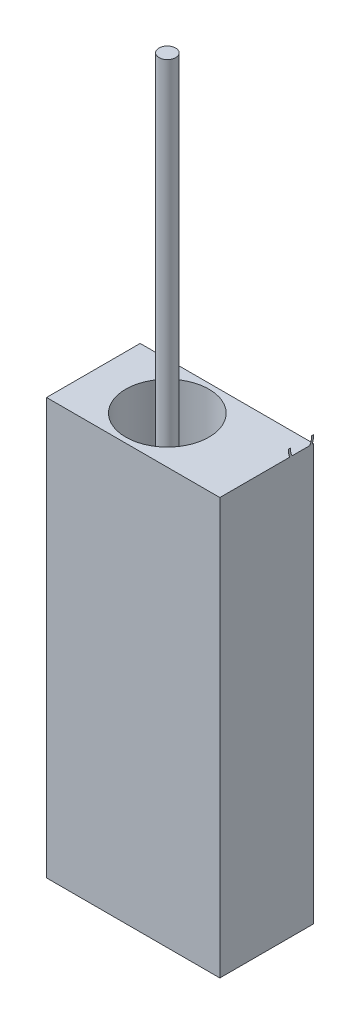
ISO-10303-21;
HEADER;
FILE_DESCRIPTION(('STEP AP214'),'2;1');
FILE_NAME('part.step','',(''),(''),'','','');
FILE_SCHEMA(('AUTOMOTIVE_DESIGN { 1 0 10303 214 1 1 1 1 }'));
ENDSEC;
DATA;
#1=APPLICATION_CONTEXT('core data for automotive mechanical design processes');
#2=APPLICATION_PROTOCOL_DEFINITION('international standard','automotive_design',2000,#1);
#3=PRODUCT_CONTEXT('',#1,'mechanical');
#4=PRODUCT('Part','Part','',(#3));
#5=PRODUCT_RELATED_PRODUCT_CATEGORY('part','',(#4));
#6=PRODUCT_DEFINITION_FORMATION('','',#4);
#7=PRODUCT_DEFINITION_CONTEXT('part definition',#1,'design');
#8=PRODUCT_DEFINITION('design','',#6,#7);
#9=PRODUCT_DEFINITION_SHAPE('','',#8);
#10=(LENGTH_UNIT() NAMED_UNIT(*) SI_UNIT(.MILLI.,.METRE.));
#11=(NAMED_UNIT(*) PLANE_ANGLE_UNIT() SI_UNIT($,.RADIAN.));
#12=(NAMED_UNIT(*) SI_UNIT($,.STERADIAN.) SOLID_ANGLE_UNIT());
#13=UNCERTAINTY_MEASURE_WITH_UNIT(LENGTH_MEASURE(1.E-05),#10,'distance_accuracy_value','');
#14=(GEOMETRIC_REPRESENTATION_CONTEXT(3) GLOBAL_UNCERTAINTY_ASSIGNED_CONTEXT((#13)) GLOBAL_UNIT_ASSIGNED_CONTEXT((#10,
#11,#12)) REPRESENTATION_CONTEXT('',''));
#15=CARTESIAN_POINT('',(0.,0.,0.));
#16=DIRECTION('',(0.,0.,1.));
#17=DIRECTION('',(1.,0.,0.));
#18=AXIS2_PLACEMENT_3D('',#15,#16,#17);
#19=CARTESIAN_POINT('',(-90.4994041492041,-2.69736399204684,56.4999999999975));
#20=DIRECTION('',(0.,1.,0.));
#21=DIRECTION('',(0.,0.,1.));
#22=AXIS2_PLACEMENT_3D('',#19,#20,#21);
#23=CYLINDRICAL_SURFACE('',#22,4.00000000000001);
#24=CARTESIAN_POINT('',(-90.4994041492041,-2.69736399204684,56.4999999999975));
#25=DIRECTION('',(0.,1.,0.));
#26=DIRECTION('',(0.,0.,1.));
#27=AXIS2_PLACEMENT_3D('',#24,#25,#26);
#28=CIRCLE('',#27,4.00000000000001);
#29=CARTESIAN_POINT('',(-90.4994041492041,-2.69736399204684,60.4999999999976));
#30=VERTEX_POINT('',#29);
#31=EDGE_CURVE('E11',#30,#30,#28,.T.);
#32=ORIENTED_EDGE('',*,*,#31,.T.);
#33=EDGE_LOOP('',(#32));
#34=FACE_BOUND('',#33,.T.);
#35=CARTESIAN_POINT('',(-90.4994041492041,297.302636007953,56.4999999999975));
#36=DIRECTION('',(0.,1.,0.));
#37=DIRECTION('',(0.,0.,1.));
#38=AXIS2_PLACEMENT_3D('',#35,#36,#37);
#39=CIRCLE('',#38,4.00000000000001);
#40=CARTESIAN_POINT('',(-90.4994041492041,297.302636007953,60.4999999999976));
#41=VERTEX_POINT('',#40);
#42=EDGE_CURVE('E44',#41,#41,#39,.T.);
#43=ORIENTED_EDGE('',*,*,#42,.F.);
#44=EDGE_LOOP('',(#43));
#45=FACE_BOUND('',#44,.T.);
#46=ADVANCED_FACE('F41',(#34,#45),#23,.T.);
#47=CARTESIAN_POINT('',(-90.4994041492041,-2.69736399204684,56.4999999999975));
#48=DIRECTION('',(0.,1.,0.));
#49=DIRECTION('',(0.,0.,1.));
#50=AXIS2_PLACEMENT_3D('',#47,#48,#49);
#51=PLANE('',#50);
#52=ORIENTED_EDGE('',*,*,#31,.F.);
#53=EDGE_LOOP('',(#52));
#54=FACE_BOUND('',#53,.T.);
#55=ADVANCED_FACE('F56',(#54),#51,.F.);
#56=CARTESIAN_POINT('',(-90.4994041492041,297.302636007953,56.4999999999975));
#57=DIRECTION('',(0.,1.,0.));
#58=DIRECTION('',(0.,0.,1.));
#59=AXIS2_PLACEMENT_3D('',#56,#57,#58);
#60=PLANE('',#59);
#61=ORIENTED_EDGE('',*,*,#42,.T.);
#62=EDGE_LOOP('',(#61));
#63=FACE_BOUND('',#62,.T.);
#64=ADVANCED_FACE('F53',(#63),#60,.T.);
#65=CLOSED_SHELL('',(#46,#55,#64));
#66=MANIFOLD_SOLID_BREP('B2',#65);
#67=CARTESIAN_POINT('',(-42.7700000000017,150.,39.9999999999982));
#68=DIRECTION('',(1.,0.,0.));
#69=DIRECTION('',(0.,0.,-1.));
#70=AXIS2_PLACEMENT_3D('',#67,#68,#69);
#71=CYLINDRICAL_SURFACE('',#70,5.);
#72=DIRECTION('',(1.,0.,0.));
#73=VECTOR('',#72,1.);
#74=CARTESIAN_POINT('',(-42.7700000000019,150.,44.9999999999982));
#75=LINE('',#74,#73);
#76=CARTESIAN_POINT('',(-42.7700000000019,150.,44.9999999999982));
#77=VERTEX_POINT('',#76);
#78=CARTESIAN_POINT('',(-42.7652962136165,150.,44.9999999999982));
#79=VERTEX_POINT('',#78);
#80=EDGE_CURVE('E265',#77,#79,#75,.T.);
#81=ORIENTED_EDGE('',*,*,#80,.T.);
#82=CARTESIAN_POINT('',(-42.7652962136165,150.,39.9999999999982));
#83=DIRECTION('',(-1.,0.,0.));
#84=DIRECTION('',(0.,0.,1.));
#85=AXIS2_PLACEMENT_3D('',#82,#83,#84);
#86=CIRCLE('',#85,5.);
#87=CARTESIAN_POINT('',(-42.7652962136165,147.302636007953,44.2100151418248));
#88=VERTEX_POINT('',#87);
#89=EDGE_CURVE('E102',#79,#88,#86,.F.);
#90=ORIENTED_EDGE('',*,*,#89,.T.);
#91=DIRECTION('',(1.,0.,0.));
#92=VECTOR('',#91,1.);
#93=CARTESIAN_POINT('',(-42.7700000000019,147.302636007953,44.2100151418248));
#94=LINE('',#93,#92);
#95=CARTESIAN_POINT('',(-42.7700000000019,147.302636007953,44.2100151418248));
#96=VERTEX_POINT('',#95);
#97=EDGE_CURVE('E230',#96,#88,#94,.T.);
#98=ORIENTED_EDGE('',*,*,#97,.F.);
#99=CARTESIAN_POINT('',(-42.7700000000017,150.,39.9999999999982));
#100=DIRECTION('',(1.,0.,0.));
#101=DIRECTION('',(0.,0.,1.));
#102=AXIS2_PLACEMENT_3D('',#99,#100,#101);
#103=CIRCLE('',#102,5.);
#104=EDGE_CURVE('E246',#77,#96,#103,.T.);
#105=ORIENTED_EDGE('',*,*,#104,.F.);
#106=EDGE_LOOP('',(#81,#90,#98,#105));
#107=FACE_BOUND('',#106,.T.);
#108=ADVANCED_FACE('F82',(#107),#71,.F.);
#109=CARTESIAN_POINT('',(-42.7700000000017,150.,39.9999999999982));
#110=DIRECTION('',(1.,0.,0.));
#111=DIRECTION('',(0.,0.,-1.));
#112=AXIS2_PLACEMENT_3D('',#109,#110,#111);
#113=CYLINDRICAL_SURFACE('',#112,6.);
#114=DIRECTION('',(1.,0.,0.));
#115=VECTOR('',#114,1.);
#116=CARTESIAN_POINT('',(-42.7700000000014,150.,33.9999999999982));
#117=LINE('',#116,#115);
#118=CARTESIAN_POINT('',(-42.7700000000014,150.,33.9999999999982));
#119=VERTEX_POINT('',#118);
#120=CARTESIAN_POINT('',(-42.7652962136165,150.,33.9999999999975));
#121=VERTEX_POINT('',#120);
#122=EDGE_CURVE('E277',#119,#121,#117,.T.);
#123=ORIENTED_EDGE('',*,*,#122,.T.);
#124=CARTESIAN_POINT('',(-42.7652962136165,150.,39.9999999999982));
#125=DIRECTION('',(-1.,0.,0.));
#126=DIRECTION('',(0.,0.,1.));
#127=AXIS2_PLACEMENT_3D('',#124,#125,#126);
#128=CIRCLE('',#127,6.);
#129=CARTESIAN_POINT('',(-42.7652962136165,147.302636007953,34.6405011899966));
#130=VERTEX_POINT('',#129);
#131=EDGE_CURVE('E341',#121,#130,#128,.T.);
#132=ORIENTED_EDGE('',*,*,#131,.T.);
#133=DIRECTION('',(1.,0.,0.));
#134=VECTOR('',#133,1.);
#135=CARTESIAN_POINT('',(-42.7700000000015,147.302636007953,34.6405011899966));
#136=LINE('',#135,#134);
#137=CARTESIAN_POINT('',(-42.7700000000015,147.302636007953,34.6405011899966));
#138=VERTEX_POINT('',#137);
#139=EDGE_CURVE('E240',#138,#130,#136,.T.);
#140=ORIENTED_EDGE('',*,*,#139,.F.);
#141=CARTESIAN_POINT('',(-42.7700000000017,150.,39.9999999999982));
#142=DIRECTION('',(-1.,0.,0.));
#143=DIRECTION('',(0.,0.,1.));
#144=AXIS2_PLACEMENT_3D('',#141,#142,#143);
#145=CIRCLE('',#144,6.);
#146=EDGE_CURVE('E256',#119,#138,#145,.T.);
#147=ORIENTED_EDGE('',*,*,#146,.F.);
#148=EDGE_LOOP('',(#123,#132,#140,#147));
#149=FACE_BOUND('',#148,.T.);
#150=ADVANCED_FACE('F355',(#149),#113,.T.);
#151=DIRECTION('',(1.,0.,0.));
#152=VECTOR('',#151,1.);
#153=CARTESIAN_POINT('',(-42.7700000000015,147.302636007953,35.7899848581716));
#154=LINE('',#153,#152);
#155=CARTESIAN_POINT('',(-42.7652962136165,147.302636007953,35.7899848581716));
#156=VERTEX_POINT('',#155);
#157=CARTESIAN_POINT('',(-42.7700000000015,147.302636007953,35.7899848581716));
#158=VERTEX_POINT('',#157);
#159=EDGE_CURVE('E243',#156,#158,#154,.F.);
#160=ORIENTED_EDGE('',*,*,#159,.F.);
#161=CARTESIAN_POINT('',(-42.7652962136165,150.,34.9999999999982));
#162=VERTEX_POINT('',#161);
#163=EDGE_CURVE('E320',#156,#162,#86,.F.);
#164=ORIENTED_EDGE('',*,*,#163,.T.);
#165=DIRECTION('',(1.,0.,0.));
#166=VECTOR('',#165,1.);
#167=CARTESIAN_POINT('',(-42.7700000000015,150.,34.9999999999982));
#168=LINE('',#167,#166);
#169=CARTESIAN_POINT('',(-42.7700000000015,150.,34.9999999999982));
#170=VERTEX_POINT('',#169);
#171=EDGE_CURVE('E286',#170,#162,#168,.T.);
#172=ORIENTED_EDGE('',*,*,#171,.F.);
#173=EDGE_CURVE('E245',#158,#170,#103,.T.);
#174=ORIENTED_EDGE('',*,*,#173,.F.);
#175=EDGE_LOOP('',(#160,#164,#172,#174));
#176=FACE_BOUND('',#175,.T.);
#177=ADVANCED_FACE('F84',(#176),#71,.F.);
#178=DIRECTION('',(1.,0.,0.));
#179=VECTOR('',#178,1.);
#180=CARTESIAN_POINT('',(-42.7700000000019,147.302636007953,45.3594988099999));
#181=LINE('',#180,#179);
#182=CARTESIAN_POINT('',(-42.7652962136165,147.302636007953,45.3594988099999));
#183=VERTEX_POINT('',#182);
#184=CARTESIAN_POINT('',(-42.7700000000019,147.302636007953,45.3594988099999));
#185=VERTEX_POINT('',#184);
#186=EDGE_CURVE('E110',#183,#185,#181,.F.);
#187=ORIENTED_EDGE('',*,*,#186,.F.);
#188=CARTESIAN_POINT('',(-42.7652962136165,150.,45.9999999999982));
#189=VERTEX_POINT('',#188);
#190=EDGE_CURVE('E298',#183,#189,#128,.T.);
#191=ORIENTED_EDGE('',*,*,#190,.T.);
#192=DIRECTION('',(1.,0.,0.));
#193=VECTOR('',#192,1.);
#194=CARTESIAN_POINT('',(-42.7700000000019,150.,45.9999999999982));
#195=LINE('',#194,#193);
#196=CARTESIAN_POINT('',(-42.7700000000019,150.,45.9999999999982));
#197=VERTEX_POINT('',#196);
#198=EDGE_CURVE('E274',#197,#189,#195,.T.);
#199=ORIENTED_EDGE('',*,*,#198,.F.);
#200=EDGE_CURVE('E255',#185,#197,#145,.T.);
#201=ORIENTED_EDGE('',*,*,#200,.F.);
#202=EDGE_LOOP('',(#187,#191,#199,#201));
#203=FACE_BOUND('',#202,.T.);
#204=ADVANCED_FACE('F295',(#203),#113,.T.);
#205=CARTESIAN_POINT('',(-42.7700000000017,150.,39.9999999999982));
#206=DIRECTION('',(-1.,0.,0.));
#207=DIRECTION('',(0.,0.,1.));
#208=AXIS2_PLACEMENT_3D('',#205,#206,#207);
#209=PLANE('',#208);
#210=ORIENTED_EDGE('',*,*,#146,.T.);
#211=DIRECTION('',(0.,0.,1.));
#212=VECTOR('',#211,1.);
#213=CARTESIAN_POINT('',(-42.7700000000017,147.302636007953,39.9999999999982));
#214=LINE('',#213,#212);
#215=EDGE_CURVE('E39',#138,#158,#214,.T.);
#216=ORIENTED_EDGE('',*,*,#215,.T.);
#217=ORIENTED_EDGE('',*,*,#173,.T.);
#218=DIRECTION('',(0.,1.,0.));
#219=VECTOR('',#218,1.);
#220=CARTESIAN_POINT('',(-42.7700000000015,150.,34.9999999999982));
#221=LINE('',#220,#219);
#222=CARTESIAN_POINT('',(-42.7700000000015,151.,34.9999999999982));
#223=VERTEX_POINT('',#222);
#224=EDGE_CURVE('E249',#170,#223,#221,.T.);
#225=ORIENTED_EDGE('',*,*,#224,.T.);
#226=DIRECTION('',(0.,0.,-1.));
#227=VECTOR('',#226,1.);
#228=CARTESIAN_POINT('',(-42.7700000000015,151.,34.9999999999982));
#229=LINE('',#228,#227);
#230=CARTESIAN_POINT('',(-42.7700000000014,151.,33.9999999999982));
#231=VERTEX_POINT('',#230);
#232=EDGE_CURVE('E251',#223,#231,#229,.T.);
#233=ORIENTED_EDGE('',*,*,#232,.T.);
#234=DIRECTION('',(0.,-1.,0.));
#235=VECTOR('',#234,1.);
#236=CARTESIAN_POINT('',(-42.7700000000014,151.,33.9999999999982));
#237=LINE('',#236,#235);
#238=EDGE_CURVE('E253',#231,#119,#237,.T.);
#239=ORIENTED_EDGE('',*,*,#238,.T.);
#240=EDGE_LOOP('',(#210,#216,#217,#225,#233,#239));
#241=FACE_BOUND('',#240,.T.);
#242=ADVANCED_FACE('F357',(#241),#209,.T.);
#243=ORIENTED_EDGE('',*,*,#104,.T.);
#244=EDGE_CURVE('E95',#96,#185,#214,.T.);
#245=ORIENTED_EDGE('',*,*,#244,.T.);
#246=ORIENTED_EDGE('',*,*,#200,.T.);
#247=DIRECTION('',(0.,1.,0.));
#248=VECTOR('',#247,1.);
#249=CARTESIAN_POINT('',(-42.7700000000019,150.,45.9999999999982));
#250=LINE('',#249,#248);
#251=CARTESIAN_POINT('',(-42.7700000000019,151.,45.9999999999982));
#252=VERTEX_POINT('',#251);
#253=EDGE_CURVE('E259',#197,#252,#250,.T.);
#254=ORIENTED_EDGE('',*,*,#253,.T.);
#255=DIRECTION('',(0.,0.,-1.));
#256=VECTOR('',#255,1.);
#257=CARTESIAN_POINT('',(-42.7700000000019,151.,45.9999999999982));
#258=LINE('',#257,#256);
#259=CARTESIAN_POINT('',(-42.7700000000019,151.,44.9999999999982));
#260=VERTEX_POINT('',#259);
#261=EDGE_CURVE('E261',#252,#260,#258,.T.);
#262=ORIENTED_EDGE('',*,*,#261,.T.);
#263=DIRECTION('',(0.,-1.,0.));
#264=VECTOR('',#263,1.);
#265=CARTESIAN_POINT('',(-42.7700000000019,151.,44.9999999999982));
#266=LINE('',#265,#264);
#267=EDGE_CURVE('E263',#260,#77,#266,.T.);
#268=ORIENTED_EDGE('',*,*,#267,.T.);
#269=EDGE_LOOP('',(#243,#245,#246,#254,#262,#268));
#270=FACE_BOUND('',#269,.T.);
#271=ADVANCED_FACE('F290',(#270),#209,.T.);
#272=CARTESIAN_POINT('',(-42.7700000000015,150.,34.9999999999982));
#273=DIRECTION('',(0.,0.,-1.));
#274=DIRECTION('',(-1.,0.,0.));
#275=AXIS2_PLACEMENT_3D('',#272,#273,#274);
#276=PLANE('',#275);
#277=ORIENTED_EDGE('',*,*,#171,.T.);
#278=DIRECTION('',(0.,1.,0.));
#279=VECTOR('',#278,1.);
#280=CARTESIAN_POINT('',(-42.7652962136165,150.,34.9999999999982));
#281=LINE('',#280,#279);
#282=CARTESIAN_POINT('',(-42.7652962136165,151.,34.9999999999982));
#283=VERTEX_POINT('',#282);
#284=EDGE_CURVE('E366',#162,#283,#281,.T.);
#285=ORIENTED_EDGE('',*,*,#284,.T.);
#286=DIRECTION('',(1.,0.,0.));
#287=VECTOR('',#286,1.);
#288=CARTESIAN_POINT('',(-42.7700000000015,151.,34.9999999999982));
#289=LINE('',#288,#287);
#290=EDGE_CURVE('E283',#223,#283,#289,.T.);
#291=ORIENTED_EDGE('',*,*,#290,.F.);
#292=ORIENTED_EDGE('',*,*,#224,.F.);
#293=EDGE_LOOP('',(#277,#285,#291,#292));
#294=FACE_BOUND('',#293,.T.);
#295=ADVANCED_FACE('F413',(#294),#276,.F.);
#296=CARTESIAN_POINT('',(-42.7700000000015,151.,34.9999999999982));
#297=DIRECTION('',(0.,-1.,0.));
#298=DIRECTION('',(0.,0.,-1.));
#299=AXIS2_PLACEMENT_3D('',#296,#297,#298);
#300=PLANE('',#299);
#301=ORIENTED_EDGE('',*,*,#290,.T.);
#302=DIRECTION('',(0.,0.,-1.));
#303=VECTOR('',#302,1.);
#304=CARTESIAN_POINT('',(-42.7652962136165,151.,34.9999999999982));
#305=LINE('',#304,#303);
#306=CARTESIAN_POINT('',(-42.7652962136165,151.,33.9999999999975));
#307=VERTEX_POINT('',#306);
#308=EDGE_CURVE('E364',#283,#307,#305,.T.);
#309=ORIENTED_EDGE('',*,*,#308,.T.);
#310=DIRECTION('',(1.,0.,0.));
#311=VECTOR('',#310,1.);
#312=CARTESIAN_POINT('',(-42.7700000000014,151.,33.9999999999982));
#313=LINE('',#312,#311);
#314=EDGE_CURVE('E280',#231,#307,#313,.T.);
#315=ORIENTED_EDGE('',*,*,#314,.F.);
#316=ORIENTED_EDGE('',*,*,#232,.F.);
#317=EDGE_LOOP('',(#301,#309,#315,#316));
#318=FACE_BOUND('',#317,.T.);
#319=ADVANCED_FACE('F363',(#318),#300,.F.);
#320=CARTESIAN_POINT('',(-42.7700000000014,151.,33.9999999999982));
#321=DIRECTION('',(0.,0.,1.));
#322=DIRECTION('',(1.,0.,0.));
#323=AXIS2_PLACEMENT_3D('',#320,#321,#322);
#324=PLANE('',#323);
#325=ORIENTED_EDGE('',*,*,#314,.T.);
#326=DIRECTION('',(0.,1.,0.));
#327=VECTOR('',#326,1.);
#328=CARTESIAN_POINT('',(-42.7652962136165,-131.697363992047,33.9999999999975));
#329=LINE('',#328,#327);
#330=EDGE_CURVE('E343',#121,#307,#329,.T.);
#331=ORIENTED_EDGE('',*,*,#330,.F.);
#332=ORIENTED_EDGE('',*,*,#122,.F.);
#333=ORIENTED_EDGE('',*,*,#238,.F.);
#334=EDGE_LOOP('',(#325,#331,#332,#333));
#335=FACE_BOUND('',#334,.T.);
#336=ADVANCED_FACE('F350',(#335),#324,.F.);
#337=CARTESIAN_POINT('',(-42.7700000000019,150.,45.9999999999982));
#338=DIRECTION('',(0.,0.,-1.));
#339=DIRECTION('',(-1.,0.,0.));
#340=AXIS2_PLACEMENT_3D('',#337,#338,#339);
#341=PLANE('',#340);
#342=ORIENTED_EDGE('',*,*,#198,.T.);
#343=DIRECTION('',(0.,1.,0.));
#344=VECTOR('',#343,1.);
#345=CARTESIAN_POINT('',(-42.7652962136165,150.,45.9999999999982));
#346=LINE('',#345,#344);
#347=CARTESIAN_POINT('',(-42.7652962136165,151.,46.));
#348=VERTEX_POINT('',#347);
#349=EDGE_CURVE('E373',#189,#348,#346,.T.);
#350=ORIENTED_EDGE('',*,*,#349,.T.);
#351=DIRECTION('',(1.,0.,0.));
#352=VECTOR('',#351,1.);
#353=CARTESIAN_POINT('',(-42.7700000000019,151.,45.9999999999982));
#354=LINE('',#353,#352);
#355=EDGE_CURVE('E271',#252,#348,#354,.T.);
#356=ORIENTED_EDGE('',*,*,#355,.F.);
#357=ORIENTED_EDGE('',*,*,#253,.F.);
#358=EDGE_LOOP('',(#342,#350,#356,#357));
#359=FACE_BOUND('',#358,.T.);
#360=ADVANCED_FACE('F302',(#359),#341,.F.);
#361=CARTESIAN_POINT('',(-42.7700000000019,151.,45.9999999999982));
#362=DIRECTION('',(0.,-1.,0.));
#363=DIRECTION('',(0.,0.,-1.));
#364=AXIS2_PLACEMENT_3D('',#361,#362,#363);
#365=PLANE('',#364);
#366=ORIENTED_EDGE('',*,*,#355,.T.);
#367=DIRECTION('',(0.,0.,-1.));
#368=VECTOR('',#367,1.);
#369=CARTESIAN_POINT('',(-42.7652962136165,151.,45.9999999999982));
#370=LINE('',#369,#368);
#371=CARTESIAN_POINT('',(-42.7652962136165,151.,44.9999999999982));
#372=VERTEX_POINT('',#371);
#373=EDGE_CURVE('E310',#348,#372,#370,.T.);
#374=ORIENTED_EDGE('',*,*,#373,.T.);
#375=DIRECTION('',(1.,0.,0.));
#376=VECTOR('',#375,1.);
#377=CARTESIAN_POINT('',(-42.7700000000019,151.,44.9999999999982));
#378=LINE('',#377,#376);
#379=EDGE_CURVE('E268',#260,#372,#378,.T.);
#380=ORIENTED_EDGE('',*,*,#379,.F.);
#381=ORIENTED_EDGE('',*,*,#261,.F.);
#382=EDGE_LOOP('',(#366,#374,#380,#381));
#383=FACE_BOUND('',#382,.T.);
#384=ADVANCED_FACE('F309',(#383),#365,.F.);
#385=CARTESIAN_POINT('',(-42.7700000000019,151.,44.9999999999982));
#386=DIRECTION('',(0.,0.,1.));
#387=DIRECTION('',(1.,0.,0.));
#388=AXIS2_PLACEMENT_3D('',#385,#386,#387);
#389=PLANE('',#388);
#390=ORIENTED_EDGE('',*,*,#379,.T.);
#391=DIRECTION('',(0.,-1.,0.));
#392=VECTOR('',#391,1.);
#393=CARTESIAN_POINT('',(-42.7652962136165,151.,44.9999999999982));
#394=LINE('',#393,#392);
#395=EDGE_CURVE('E313',#372,#79,#394,.T.);
#396=ORIENTED_EDGE('',*,*,#395,.T.);
#397=ORIENTED_EDGE('',*,*,#80,.F.);
#398=ORIENTED_EDGE('',*,*,#267,.F.);
#399=EDGE_LOOP('',(#390,#396,#397,#398));
#400=FACE_BOUND('',#399,.T.);
#401=ADVANCED_FACE('F312',(#400),#389,.F.);
#402=CARTESIAN_POINT('',(0.,-52.6973639920468,0.));
#403=DIRECTION('',(0.,-1.,0.));
#404=DIRECTION('',(0.,0.,-1.));
#405=AXIS2_PLACEMENT_3D('',#402,#403,#404);
#406=PLANE('',#405);
#407=DIRECTION('',(1.,0.,0.));
#408=VECTOR('',#407,1.);
#409=CARTESIAN_POINT('',(-42.7652962136165,-52.6973639920468,33.9999999999975));
#410=LINE('',#409,#408);
#411=CARTESIAN_POINT('',(-126.059810936361,-52.6973639920468,33.9999999999975));
#412=VERTEX_POINT('',#411);
#413=CARTESIAN_POINT('',(-42.7652962136165,-52.6973639920468,33.9999999999975));
#414=VERTEX_POINT('',#413);
#415=EDGE_CURVE('E216',#412,#414,#410,.T.);
#416=ORIENTED_EDGE('',*,*,#415,.T.);
#417=DIRECTION('',(0.,0.,1.));
#418=VECTOR('',#417,1.);
#419=CARTESIAN_POINT('',(-42.7652962136165,-52.6973639920468,33.9999999999975));
#420=LINE('',#419,#418);
#421=CARTESIAN_POINT('',(-42.7652962136165,-52.6973639920468,78.9999999999975));
#422=VERTEX_POINT('',#421);
#423=EDGE_CURVE('E199',#414,#422,#420,.T.);
#424=ORIENTED_EDGE('',*,*,#423,.T.);
#425=DIRECTION('',(-1.,0.,0.));
#426=VECTOR('',#425,1.);
#427=CARTESIAN_POINT('',(-42.7652962136165,-52.6973639920468,78.9999999999975));
#428=LINE('',#427,#426);
#429=CARTESIAN_POINT('',(-126.059810936361,-52.6973639920468,78.9999999999975));
#430=VERTEX_POINT('',#429);
#431=EDGE_CURVE('E211',#422,#430,#428,.T.);
#432=ORIENTED_EDGE('',*,*,#431,.T.);
#433=DIRECTION('',(0.,0.,-1.));
#434=VECTOR('',#433,1.);
#435=CARTESIAN_POINT('',(-126.059810936361,-52.6973639920468,33.9999999999975));
#436=LINE('',#435,#434);
#437=EDGE_CURVE('E220',#430,#412,#436,.T.);
#438=ORIENTED_EDGE('',*,*,#437,.T.);
#439=EDGE_LOOP('',(#416,#424,#432,#438));
#440=FACE_BOUND('',#439,.T.);
#441=CARTESIAN_POINT('',(-90.4994041492041,-52.6973639920468,56.4999999999975));
#442=DIRECTION('',(0.,-1.,0.));
#443=DIRECTION('',(0.,0.,-1.));
#444=AXIS2_PLACEMENT_3D('',#441,#442,#443);
#445=CIRCLE('',#444,7.5);
#446=CARTESIAN_POINT('',(-90.4994041492041,-52.6973639920468,48.9999999999975));
#447=VERTEX_POINT('',#446);
#448=EDGE_CURVE('E380',#447,#447,#445,.T.);
#449=ORIENTED_EDGE('',*,*,#448,.F.);
#450=EDGE_LOOP('',(#449));
#451=FACE_BOUND('',#450,.T.);
#452=ADVANCED_FACE('F217',(#440,#451),#406,.T.);
#453=CARTESIAN_POINT('',(-90.5054940235545,-16.1481793509691,-60.5));
#454=DIRECTION('',(0.,0.,1.));
#455=DIRECTION('',(1.,0.,0.));
#456=AXIS2_PLACEMENT_3D('',#453,#454,#455);
#457=CYLINDRICAL_SURFACE('',#456,5.00000000000016);
#458=CARTESIAN_POINT('',(-90.5054940235545,-16.1481793509691,33.9999999999975));
#459=DIRECTION('',(0.,0.,-1.));
#460=DIRECTION('',(-1.,0.,0.));
#461=AXIS2_PLACEMENT_3D('',#458,#459,#460);
#462=CIRCLE('',#461,5.00000000000015);
#463=CARTESIAN_POINT('',(-95.5054940235547,-16.1481793509691,33.9999999999975));
#464=VERTEX_POINT('',#463);
#465=EDGE_CURVE('E346',#464,#464,#462,.T.);
#466=ORIENTED_EDGE('',*,*,#465,.T.);
#467=EDGE_LOOP('',(#466));
#468=FACE_BOUND('',#467,.T.);
#469=CARTESIAN_POINT('',(-95.5054940235547,-16.1481793509691,37.1366566892486));
#470=CARTESIAN_POINT('',(-95.5054861799988,-15.8720917738091,37.1366514157004));
#471=CARTESIAN_POINT('',(-95.4825487973589,-15.5959174088472,37.1306801896687));
#472=CARTESIAN_POINT('',(-95.3915519680504,-15.051499936641,37.1075009855879));
#473=CARTESIAN_POINT('',(-95.3234662566023,-14.7832615410414,37.0902864669061));
#474=CARTESIAN_POINT('',(-95.1445151263476,-14.262669931946,37.0466879011243));
#475=CARTESIAN_POINT('',(-95.0337050308056,-14.0102966644023,37.0203157165409));
#476=CARTESIAN_POINT('',(-94.7726195082833,-13.5276950912633,36.9613852729219));
#477=CARTESIAN_POINT('',(-94.6223423972951,-13.2974677311789,36.9288267499394));
#478=CARTESIAN_POINT('',(-94.2830489050013,-12.8606154260335,36.8603845087447));
#479=CARTESIAN_POINT('',(-94.0933215584252,-12.6545509063696,36.8244475395984));
#480=CARTESIAN_POINT('',(-93.6820449778436,-12.2768106022803,36.7537531806452));
#481=CARTESIAN_POINT('',(-93.4604927590162,-12.1051380470624,36.7189959018586));
#482=CARTESIAN_POINT('',(-92.9880067263263,-11.7987547413509,36.6539820745919));
#483=CARTESIAN_POINT('',(-92.7367044580141,-11.6645960707981,36.6237954754791));
#484=CARTESIAN_POINT('',(-92.2142343821381,-11.440637141963,36.5719250532128));
#485=CARTESIAN_POINT('',(-91.9430695094313,-11.3508303454616,36.5502399768877));
#486=CARTESIAN_POINT('',(-91.394397513714,-11.2199163512601,36.5181846976159));
#487=CARTESIAN_POINT('',(-91.1171299555587,-11.1778599698327,36.5075942970236));
#488=CARTESIAN_POINT('',(-90.5592856640236,-11.1406629871677,36.4981455106278));
#489=CARTESIAN_POINT('',(-90.2787094272406,-11.1455154327277,36.4992853860705));
#490=CARTESIAN_POINT('',(-89.7288156514482,-11.2013156606299,36.5129990869699));
#491=CARTESIAN_POINT('',(-89.4593865009697,-11.251235730091,36.525318019761));
#492=CARTESIAN_POINT('',(-88.9328554769028,-11.3941039051164,36.5596996799749));
#493=CARTESIAN_POINT('',(-88.6757542560252,-11.4870542861802,36.5817629226869));
#494=CARTESIAN_POINT('',(-88.1784950359574,-11.7141667540015,36.6335335249232));
#495=CARTESIAN_POINT('',(-87.9385096707629,-11.8486909697997,36.6633076657497));
#496=CARTESIAN_POINT('',(-87.4841599126707,-12.1548577886832,36.7272657154226));
#497=CARTESIAN_POINT('',(-87.2697999810238,-12.3265068404335,36.7614503899715));
#498=CARTESIAN_POINT('',(-86.8666783271318,-12.707540248937,36.8315900681112));
#499=CARTESIAN_POINT('',(-86.678765502295,-12.9178194575496,36.867567946899));
#500=CARTESIAN_POINT('',(-86.3406796333794,-13.3672796513567,36.9363893504412));
#501=CARTESIAN_POINT('',(-86.1905083603281,-13.6064619920551,36.9692327280638));
#502=CARTESIAN_POINT('',(-85.9316176236982,-14.1086160032686,37.0281454070096));
#503=CARTESIAN_POINT('',(-85.8231044920084,-14.3716983050592,37.0541807908635));
#504=CARTESIAN_POINT('',(-85.6521100532675,-14.9131784132039,37.0960938305869));
#505=CARTESIAN_POINT('',(-85.589618923818,-15.1915729378567,37.1119736538453));
#506=CARTESIAN_POINT('',(-85.5138484966106,-15.7479177883247,37.1313207419243));
#507=CARTESIAN_POINT('',(-85.4993164779451,-16.0256867158166,37.1351038951753));
#508=CARTESIAN_POINT('',(-85.5164470489741,-16.5796813605914,37.1306887798934));
#509=CARTESIAN_POINT('',(-85.5481053943825,-16.8559072173212,37.1224916121942));
#510=CARTESIAN_POINT('',(-85.6556187455203,-17.394317964027,37.0953432946704));
#511=CARTESIAN_POINT('',(-85.7307435643415,-17.6566584836041,37.0765699465077));
#512=CARTESIAN_POINT('',(-85.9222478050422,-18.1650226411896,37.0305553074811));
#513=CARTESIAN_POINT('',(-86.0386321076344,-18.4110443447057,37.0033130148463));
#514=CARTESIAN_POINT('',(-86.3119761180764,-18.885099315353,36.9427673353801));
#515=CARTESIAN_POINT('',(-86.4696854706908,-19.1126862054093,36.90935574448));
#516=CARTESIAN_POINT('',(-86.8202555838254,-19.5386259460683,36.8405058377901));
#517=CARTESIAN_POINT('',(-87.0131221071909,-19.7369739942833,36.8050671903865));
#518=CARTESIAN_POINT('',(-87.4342817715157,-20.1038800011089,36.7350909020467));
#519=CARTESIAN_POINT('',(-87.6633386782509,-20.2715713300943,36.7005977947883));
#520=CARTESIAN_POINT('',(-88.1470892077128,-20.566108933063,36.637320707604));
#521=CARTESIAN_POINT('',(-88.4017814835859,-20.6929573514182,36.6085364279783));
#522=CARTESIAN_POINT('',(-88.9278012438185,-20.9011031888696,36.5601092326722));
#523=CARTESIAN_POINT('',(-89.1989920812246,-20.9827298815787,36.5404004182589));
#524=CARTESIAN_POINT('',(-89.7517985705148,-21.0991071789021,36.5120636907666));
#525=CARTESIAN_POINT('',(-90.0334122019584,-21.1338668202191,36.5034336415431));
#526=CARTESIAN_POINT('',(-90.5909149153092,-21.155016620783,36.4983186452008));
#527=CARTESIAN_POINT('',(-90.866753185842,-21.1426877979853,36.501511975742));
#528=CARTESIAN_POINT('',(-91.4122926820929,-21.0729465510608,36.5189808766187));
#529=CARTESIAN_POINT('',(-91.6819940878386,-21.0155354512003,36.5332561214291));
#530=CARTESIAN_POINT('',(-92.206281149674,-20.8579428771197,36.5712431041563));
#531=CARTESIAN_POINT('',(-92.4609395467494,-20.7579904187899,36.5949042684793));
#532=CARTESIAN_POINT('',(-92.9500140796246,-20.5183628771108,36.6491782645536));
#533=CARTESIAN_POINT('',(-93.1844276529271,-20.378682774796,36.6797919745516));
#534=CARTESIAN_POINT('',(-93.6324515348713,-20.0596456272515,36.7455939055618));
#535=CARTESIAN_POINT('',(-93.8454274259827,-19.8794166708291,36.7808742926701));
#536=CARTESIAN_POINT('',(-94.2385472502828,-19.4860905054057,36.8516211198524));
#537=CARTESIAN_POINT('',(-94.4186828437819,-19.272984972798,36.8870876048394));
#538=CARTESIAN_POINT('',(-94.7443054746832,-18.8151712420366,36.9549479852557));
#539=CARTESIAN_POINT('',(-94.8890839113279,-18.5699479200452,36.9872722674142));
#540=CARTESIAN_POINT('',(-95.1351433668221,-18.0578676628357,37.0442557063121));
#541=CARTESIAN_POINT('',(-95.2364560621751,-17.7910266511096,37.0689204414628));
#542=CARTESIAN_POINT('',(-95.3776184424817,-17.2952419276405,37.1039381447503));
#543=CARTESIAN_POINT('',(-95.4254672018902,-17.0686716864792,37.1161153229485));
#544=CARTESIAN_POINT('',(-95.4894069211209,-16.6108141235664,37.1324764629964));
#545=CARTESIAN_POINT('',(-95.50550059607,-16.3795272068093,37.1366611082235));
#546=CARTESIAN_POINT('',(-95.5054940235547,-16.1481793509691,37.1366566892486));
#547=B_SPLINE_CURVE_WITH_KNOTS('',3,(#469,#470,#471,#472,#473,#474,#475,#476,#477,#478,#479,
#480,#481,#482,#483,#484,#485,#486,#487,#488,#489,#490,#491,#492,#493,#494,#495,#496,#497,#498,
#499,#500,#501,#502,#503,#504,#505,#506,#507,#508,#509,#510,#511,#512,#513,#514,#515,#516,#517,
#518,#519,#520,#521,#522,#523,#524,#525,#526,#527,#528,#529,#530,#531,#532,#533,#534,#535,#536,
#537,#538,#539,#540,#541,#542,#543,#544,#545,#546),.UNSPECIFIED.,.T.,.F.,(4,2,2,2,2,2,2,2,2,2,2,
2,2,2,2,2,2,2,2,2,2,2,2,2,2,2,2,2,2,2,2,2,2,2,2,2,2,2,4),(0.,0.827413099997396,1.65530796555905,
2.4821343814698,3.30899608275821,4.15230135334827,4.99568576837356,5.85089708587994,
6.70598229305728,7.54375499916933,8.38140352579816,9.20041999111727,10.0194797720522,
10.8458852539371,11.6724343997098,12.5213332138182,13.3702718551888,14.2233626299256,
15.0762712781269,15.9067173339018,16.7370870874252,17.5538966614745,18.3708028907261,
19.2036995472234,20.0367328523123,20.8905481288249,21.7443185702352,22.5917878737954,
23.4390937486021,24.2635154080937,25.087912851572,25.9079273012777,26.728045393012,
27.5678493112499,28.4078661988635,29.2635443242255,30.1185977938603,30.8119887008059,
31.5053203187926),.UNSPECIFIED.);
#548=CARTESIAN_POINT('',(-95.5054940235547,-16.1481793509691,37.1366566892486));
#549=VERTEX_POINT('',#548);
#550=EDGE_CURVE('E86',#549,#549,#547,.T.);
#551=ORIENTED_EDGE('',*,*,#550,.F.);
#552=EDGE_LOOP('',(#551));
#553=FACE_BOUND('',#552,.T.);
#554=ADVANCED_FACE('F391',(#468,#553),#457,.F.);
#555=CARTESIAN_POINT('',(0.,147.302636007953,0.));
#556=DIRECTION('',(0.,-1.,0.));
#557=DIRECTION('',(0.,0.,-1.));
#558=AXIS2_PLACEMENT_3D('',#555,#556,#557);
#559=PLANE('',#558);
#560=CARTESIAN_POINT('',(-90.4994041492041,147.302636007953,56.4999999999975));
#561=DIRECTION('',(0.,1.,0.));
#562=DIRECTION('',(0.,0.,1.));
#563=AXIS2_PLACEMENT_3D('',#560,#561,#562);
#564=CIRCLE('',#563,20.);
#565=CARTESIAN_POINT('',(-90.4994041492041,147.302636007953,76.4999999999975));
#566=VERTEX_POINT('',#565);
#567=EDGE_CURVE('E326',#566,#566,#564,.T.);
#568=ORIENTED_EDGE('',*,*,#567,.F.);
#569=EDGE_LOOP('',(#568));
#570=FACE_BOUND('',#569,.T.);
#571=DIRECTION('',(0.,0.,1.));
#572=VECTOR('',#571,1.);
#573=CARTESIAN_POINT('',(-42.7652962136165,147.302636007953,33.9999999999975));
#574=LINE('',#573,#572);
#575=EDGE_CURVE('E317',#156,#88,#574,.T.);
#576=ORIENTED_EDGE('',*,*,#575,.F.);
#577=ORIENTED_EDGE('',*,*,#159,.T.);
#578=ORIENTED_EDGE('',*,*,#215,.F.);
#579=ORIENTED_EDGE('',*,*,#139,.T.);
#580=CARTESIAN_POINT('',(-42.7652962136165,147.302636007953,33.9999999999975));
#581=VERTEX_POINT('',#580);
#582=EDGE_CURVE('E321',#581,#130,#574,.T.);
#583=ORIENTED_EDGE('',*,*,#582,.F.);
#584=DIRECTION('',(1.,0.,0.));
#585=VECTOR('',#584,1.);
#586=CARTESIAN_POINT('',(-42.7652962136165,147.302636007953,33.9999999999975));
#587=LINE('',#586,#585);
#588=CARTESIAN_POINT('',(-126.059810936361,147.302636007953,33.9999999999975));
#589=VERTEX_POINT('',#588);
#590=EDGE_CURVE('E227',#589,#581,#587,.T.);
#591=ORIENTED_EDGE('',*,*,#590,.F.);
#592=DIRECTION('',(0.,0.,-1.));
#593=VECTOR('',#592,1.);
#594=CARTESIAN_POINT('',(-126.059810936361,147.302636007953,33.9999999999975));
#595=LINE('',#594,#593);
#596=CARTESIAN_POINT('',(-126.059810936361,147.302636007953,78.9999999999975));
#597=VERTEX_POINT('',#596);
#598=EDGE_CURVE('E330',#597,#589,#595,.T.);
#599=ORIENTED_EDGE('',*,*,#598,.F.);
#600=DIRECTION('',(-1.,0.,0.));
#601=VECTOR('',#600,1.);
#602=CARTESIAN_POINT('',(-42.7652962136165,147.302636007953,78.9999999999975));
#603=LINE('',#602,#601);
#604=CARTESIAN_POINT('',(-42.7652962136165,147.302636007953,78.9999999999975));
#605=VERTEX_POINT('',#604);
#606=EDGE_CURVE('E323',#605,#597,#603,.T.);
#607=ORIENTED_EDGE('',*,*,#606,.F.);
#608=EDGE_CURVE('E222',#183,#605,#574,.T.);
#609=ORIENTED_EDGE('',*,*,#608,.F.);
#610=ORIENTED_EDGE('',*,*,#186,.T.);
#611=ORIENTED_EDGE('',*,*,#244,.F.);
#612=ORIENTED_EDGE('',*,*,#97,.T.);
#613=EDGE_LOOP('',(#576,#577,#578,#579,#583,#591,#599,#607,#609,#610,#611,#612));
#614=FACE_BOUND('',#613,.T.);
#615=ADVANCED_FACE('F316',(#570,#614),#559,.F.);
#616=CARTESIAN_POINT('',(-42.7652962136165,147.302636007953,33.9999999999975));
#617=DIRECTION('',(1.,0.,0.));
#618=DIRECTION('',(0.,0.,-1.));
#619=AXIS2_PLACEMENT_3D('',#616,#617,#618);
#620=PLANE('',#619);
#621=ORIENTED_EDGE('',*,*,#575,.T.);
#622=ORIENTED_EDGE('',*,*,#89,.F.);
#623=ORIENTED_EDGE('',*,*,#395,.F.);
#624=ORIENTED_EDGE('',*,*,#373,.F.);
#625=ORIENTED_EDGE('',*,*,#349,.F.);
#626=ORIENTED_EDGE('',*,*,#190,.F.);
#627=ORIENTED_EDGE('',*,*,#608,.T.);
#628=DIRECTION('',(0.,-1.,0.));
#629=VECTOR('',#628,1.);
#630=CARTESIAN_POINT('',(-42.7652962136165,147.302636007953,78.9999999999975));
#631=LINE('',#630,#629);
#632=EDGE_CURVE('E207',#605,#422,#631,.T.);
#633=ORIENTED_EDGE('',*,*,#632,.T.);
#634=ORIENTED_EDGE('',*,*,#423,.F.);
#635=DIRECTION('',(0.,-1.,0.));
#636=VECTOR('',#635,1.);
#637=CARTESIAN_POINT('',(-42.7652962136165,147.302636007953,33.9999999999975));
#638=LINE('',#637,#636);
#639=EDGE_CURVE('E204',#581,#414,#638,.T.);
#640=ORIENTED_EDGE('',*,*,#639,.F.);
#641=ORIENTED_EDGE('',*,*,#582,.T.);
#642=ORIENTED_EDGE('',*,*,#131,.F.);
#643=ORIENTED_EDGE('',*,*,#330,.T.);
#644=ORIENTED_EDGE('',*,*,#308,.F.);
#645=ORIENTED_EDGE('',*,*,#284,.F.);
#646=ORIENTED_EDGE('',*,*,#163,.F.);
#647=EDGE_LOOP('',(#621,#622,#623,#624,#625,#626,#627,#633,#634,#640,#641,#642,#643,#644,#645,#646));
#648=FACE_BOUND('',#647,.T.);
#649=ADVANCED_FACE('F201',(#648),#620,.T.);
#650=CARTESIAN_POINT('',(-42.7652962136165,147.302636007953,33.9999999999975));
#651=DIRECTION('',(0.,0.,-1.));
#652=DIRECTION('',(-1.,0.,0.));
#653=AXIS2_PLACEMENT_3D('',#650,#651,#652);
#654=PLANE('',#653);
#655=ORIENTED_EDGE('',*,*,#465,.F.);
#656=EDGE_LOOP('',(#655));
#657=FACE_BOUND('',#656,.T.);
#658=ORIENTED_EDGE('',*,*,#639,.T.);
#659=ORIENTED_EDGE('',*,*,#415,.F.);
#660=DIRECTION('',(0.,-1.,0.));
#661=VECTOR('',#660,1.);
#662=CARTESIAN_POINT('',(-126.059810936361,147.302636007953,33.9999999999975));
#663=LINE('',#662,#661);
#664=EDGE_CURVE('E228',#589,#412,#663,.T.);
#665=ORIENTED_EDGE('',*,*,#664,.F.);
#666=ORIENTED_EDGE('',*,*,#590,.T.);
#667=EDGE_LOOP('',(#658,#659,#665,#666));
#668=FACE_BOUND('',#667,.T.);
#669=ADVANCED_FACE('F225',(#657,#668),#654,.T.);
#670=CARTESIAN_POINT('',(-126.059810936361,147.302636007953,33.9999999999975));
#671=DIRECTION('',(-1.,0.,0.));
#672=DIRECTION('',(0.,0.,1.));
#673=AXIS2_PLACEMENT_3D('',#670,#671,#672);
#674=PLANE('',#673);
#675=ORIENTED_EDGE('',*,*,#437,.F.);
#676=DIRECTION('',(0.,-1.,0.));
#677=VECTOR('',#676,1.);
#678=CARTESIAN_POINT('',(-126.059810936361,147.302636007953,78.9999999999975));
#679=LINE('',#678,#677);
#680=EDGE_CURVE('E232',#597,#430,#679,.T.);
#681=ORIENTED_EDGE('',*,*,#680,.F.);
#682=ORIENTED_EDGE('',*,*,#598,.T.);
#683=ORIENTED_EDGE('',*,*,#664,.T.);
#684=EDGE_LOOP('',(#675,#681,#682,#683));
#685=FACE_BOUND('',#684,.T.);
#686=ADVANCED_FACE('F339',(#685),#674,.T.);
#687=CARTESIAN_POINT('',(-42.7652962136165,147.302636007953,78.9999999999975));
#688=DIRECTION('',(0.,0.,1.));
#689=DIRECTION('',(1.,0.,0.));
#690=AXIS2_PLACEMENT_3D('',#687,#688,#689);
#691=PLANE('',#690);
#692=ORIENTED_EDGE('',*,*,#431,.F.);
#693=ORIENTED_EDGE('',*,*,#632,.F.);
#694=ORIENTED_EDGE('',*,*,#606,.T.);
#695=ORIENTED_EDGE('',*,*,#680,.T.);
#696=EDGE_LOOP('',(#692,#693,#694,#695));
#697=FACE_BOUND('',#696,.T.);
#698=ADVANCED_FACE('F335',(#697),#691,.T.);
#699=CARTESIAN_POINT('',(-90.4994041492041,-42.6973639920468,56.4999999999975));
#700=DIRECTION('',(0.,1.,0.));
#701=DIRECTION('',(0.,0.,1.));
#702=AXIS2_PLACEMENT_3D('',#699,#700,#701);
#703=CYLINDRICAL_SURFACE('',#702,20.);
#704=ORIENTED_EDGE('',*,*,#550,.T.);
#705=EDGE_LOOP('',(#704));
#706=FACE_BOUND('',#705,.T.);
#707=CARTESIAN_POINT('',(-90.4994041492041,-42.6973639920468,56.4999999999975));
#708=DIRECTION('',(0.,1.,0.));
#709=DIRECTION('',(0.,0.,1.));
#710=AXIS2_PLACEMENT_3D('',#707,#708,#709);
#711=CIRCLE('',#710,20.);
#712=CARTESIAN_POINT('',(-90.4994041492041,-42.6973639920468,76.4999999999975));
#713=VERTEX_POINT('',#712);
#714=EDGE_CURVE('E212',#713,#713,#711,.T.);
#715=ORIENTED_EDGE('',*,*,#714,.F.);
#716=EDGE_LOOP('',(#715));
#717=FACE_BOUND('',#716,.T.);
#718=ORIENTED_EDGE('',*,*,#567,.T.);
#719=EDGE_LOOP('',(#718));
#720=FACE_BOUND('',#719,.T.);
#721=ADVANCED_FACE('F388',(#706,#717,#720),#703,.F.);
#722=CARTESIAN_POINT('',(-90.4994041492041,-42.6973639920468,56.4999999999975));
#723=DIRECTION('',(0.,1.,0.));
#724=DIRECTION('',(0.,0.,1.));
#725=AXIS2_PLACEMENT_3D('',#722,#723,#724);
#726=PLANE('',#725);
#727=CARTESIAN_POINT('',(-90.4994041492041,-42.6973639920468,56.4999999999975));
#728=DIRECTION('',(0.,1.,0.));
#729=DIRECTION('',(0.,0.,1.));
#730=AXIS2_PLACEMENT_3D('',#727,#728,#729);
#731=CIRCLE('',#730,7.5);
#732=CARTESIAN_POINT('',(-90.4994041492041,-42.6973639920468,63.9999999999975));
#733=VERTEX_POINT('',#732);
#734=EDGE_CURVE('E377',#733,#733,#731,.T.);
#735=ORIENTED_EDGE('',*,*,#734,.F.);
#736=EDGE_LOOP('',(#735));
#737=FACE_BOUND('',#736,.T.);
#738=ORIENTED_EDGE('',*,*,#714,.T.);
#739=EDGE_LOOP('',(#738));
#740=FACE_BOUND('',#739,.T.);
#741=ADVANCED_FACE('F447',(#737,#740),#726,.T.);
#742=CARTESIAN_POINT('',(-90.4994041492041,-302.697363992047,56.4999999999975));
#743=DIRECTION('',(0.,1.,0.));
#744=DIRECTION('',(0.,0.,1.));
#745=AXIS2_PLACEMENT_3D('',#742,#743,#744);
#746=CYLINDRICAL_SURFACE('',#745,7.5);
#747=ORIENTED_EDGE('',*,*,#448,.T.);
#748=EDGE_LOOP('',(#747));
#749=FACE_BOUND('',#748,.T.);
#750=ORIENTED_EDGE('',*,*,#734,.T.);
#751=EDGE_LOOP('',(#750));
#752=FACE_BOUND('',#751,.T.);
#753=ADVANCED_FACE('F451',(#749,#752),#746,.F.);
#754=CLOSED_SHELL('',(#108,#150,#177,#204,#242,#271,#295,#319,#336,#360,#384,#401,#452,#554,
#615,#649,#669,#686,#698,#721,#741,#753));
#755=MANIFOLD_SOLID_BREP('B6',#754);
#756=ADVANCED_BREP_SHAPE_REPRESENTATION('',(#18,#66,#755),#14);
#757=SHAPE_DEFINITION_REPRESENTATION(#9,#756);
ENDSEC;
END-ISO-10303-21;
